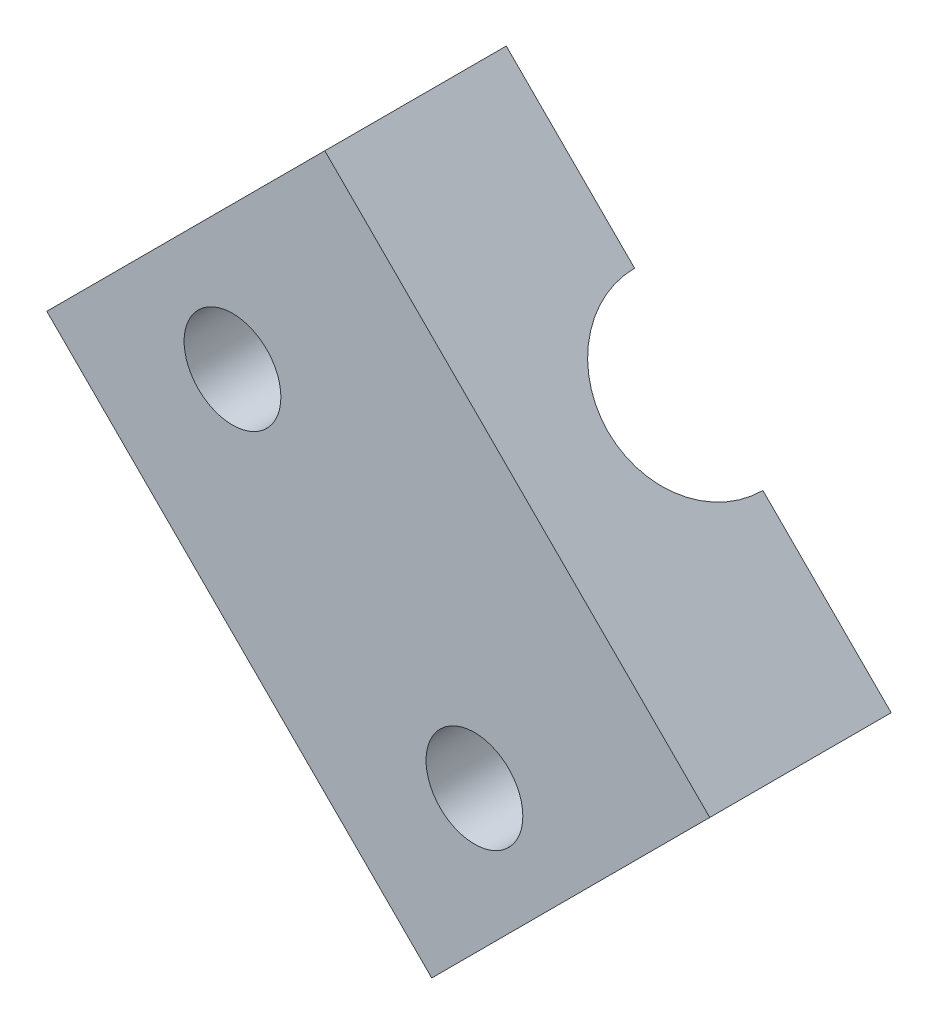
ISO-10303-21;
HEADER;
FILE_DESCRIPTION(('STEP AP214'),'2;1');
FILE_NAME('part.step','',(''),(''),'','','');
FILE_SCHEMA(('AUTOMOTIVE_DESIGN { 1 0 10303 214 1 1 1 1 }'));
ENDSEC;
DATA;
#1=APPLICATION_CONTEXT('core data for automotive mechanical design processes');
#2=APPLICATION_PROTOCOL_DEFINITION('international standard','automotive_design',2000,#1);
#3=PRODUCT_CONTEXT('',#1,'mechanical');
#4=PRODUCT('Part','Part','',(#3));
#5=PRODUCT_RELATED_PRODUCT_CATEGORY('part','',(#4));
#6=PRODUCT_DEFINITION_FORMATION('','',#4);
#7=PRODUCT_DEFINITION_CONTEXT('part definition',#1,'design');
#8=PRODUCT_DEFINITION('design','',#6,#7);
#9=PRODUCT_DEFINITION_SHAPE('','',#8);
#10=(LENGTH_UNIT() NAMED_UNIT(*) SI_UNIT(.MILLI.,.METRE.));
#11=(NAMED_UNIT(*) PLANE_ANGLE_UNIT() SI_UNIT($,.RADIAN.));
#12=(NAMED_UNIT(*) SI_UNIT($,.STERADIAN.) SOLID_ANGLE_UNIT());
#13=UNCERTAINTY_MEASURE_WITH_UNIT(LENGTH_MEASURE(1.E-05),#10,'distance_accuracy_value','');
#14=(GEOMETRIC_REPRESENTATION_CONTEXT(3) GLOBAL_UNCERTAINTY_ASSIGNED_CONTEXT((#13)) GLOBAL_UNIT_ASSIGNED_CONTEXT((#10,
#11,#12)) REPRESENTATION_CONTEXT('',''));
#15=CARTESIAN_POINT('',(0.,0.,0.));
#16=DIRECTION('',(0.,0.,1.));
#17=DIRECTION('',(1.,0.,0.));
#18=AXIS2_PLACEMENT_3D('',#15,#16,#17);
#19=CARTESIAN_POINT('',(9.19238815542513,9.1923881554251,0.));
#20=DIRECTION('',(-0.707106781186549,-0.707106781186546,0.));
#21=DIRECTION('',(0.707106781186546,-0.707106781186549,0.));
#22=AXIS2_PLACEMENT_3D('',#19,#20,#21);
#23=CYLINDRICAL_SURFACE('',#22,3.);
#24=DIRECTION('',(-0.707106781186549,-0.707106781186546,0.));
#25=VECTOR('',#24,1.);
#26=CARTESIAN_POINT('',(11.3137084989848,7.07106781186546,0.));
#27=LINE('',#26,#25);
#28=CARTESIAN_POINT('',(11.3137084989848,7.07106781186546,0.));
#29=VERTEX_POINT('',#28);
#30=CARTESIAN_POINT('',(4.24264068711929,0.,0.));
#31=VERTEX_POINT('',#30);
#32=EDGE_CURVE('E65',#29,#31,#27,.T.);
#33=ORIENTED_EDGE('',*,*,#32,.T.);
#34=CARTESIAN_POINT('',(2.12132034355965,2.12132034355964,0.));
#35=DIRECTION('',(-0.707106781186549,-0.707106781186546,0.));
#36=DIRECTION('',(0.707106781186546,-0.707106781186549,0.));
#37=AXIS2_PLACEMENT_3D('',#34,#35,#36);
#38=CIRCLE('',#37,3.);
#39=CARTESIAN_POINT('',(0.,4.24264068711929,0.));
#40=VERTEX_POINT('',#39);
#41=EDGE_CURVE('E197',#40,#31,#38,.F.);
#42=ORIENTED_EDGE('',*,*,#41,.F.);
#43=DIRECTION('',(-0.707106781186549,-0.707106781186546,0.));
#44=VECTOR('',#43,1.);
#45=CARTESIAN_POINT('',(7.0710678118655,11.3137084989848,0.));
#46=LINE('',#45,#44);
#47=CARTESIAN_POINT('',(7.0710678118655,11.3137084989848,0.));
#48=VERTEX_POINT('',#47);
#49=EDGE_CURVE('E11',#48,#40,#46,.T.);
#50=ORIENTED_EDGE('',*,*,#49,.F.);
#51=CARTESIAN_POINT('',(9.19238815542513,9.1923881554251,0.));
#52=DIRECTION('',(0.707106781186549,0.707106781186546,0.));
#53=DIRECTION('',(-0.707106781186546,0.707106781186549,0.));
#54=AXIS2_PLACEMENT_3D('',#51,#52,#53);
#55=CIRCLE('',#54,3.);
#56=EDGE_CURVE('E202',#48,#29,#55,.T.);
#57=ORIENTED_EDGE('',*,*,#56,.T.);
#58=EDGE_LOOP('',(#33,#42,#50,#57));
#59=FACE_BOUND('',#58,.T.);
#60=ADVANCED_FACE('F47',(#59),#23,.F.);
#61=CARTESIAN_POINT('',(9.19238815542513,9.1923881554251,0.));
#62=DIRECTION('',(0.,0.,-1.));
#63=DIRECTION('',(0.,1.,0.));
#64=AXIS2_PLACEMENT_3D('',#61,#62,#63);
#65=PLANE('',#64);
#66=CARTESIAN_POINT('',(-0.224049788463809,7.77595021153616,0.));
#67=DIRECTION('',(0.,0.,-1.));
#68=DIRECTION('',(0.,1.,0.));
#69=AXIS2_PLACEMENT_3D('',#66,#67,#68);
#70=CIRCLE('',#69,1.6);
#71=CARTESIAN_POINT('',(-0.224049788463809,9.37595021153616,0.));
#72=VERTEX_POINT('',#71);
#73=EDGE_CURVE('E188',#72,#72,#70,.T.);
#74=ORIENTED_EDGE('',*,*,#73,.F.);
#75=EDGE_LOOP('',(#74));
#76=FACE_BOUND('',#75,.T.);
#77=DIRECTION('',(0.707106781186546,-0.707106781186549,0.));
#78=VECTOR('',#77,1.);
#79=CARTESIAN_POINT('',(0.,0.,0.));
#80=LINE('',#79,#78);
#81=CARTESIAN_POINT('',(-6.3639610306789,6.36396103067893,0.));
#82=VERTEX_POINT('',#81);
#83=CARTESIAN_POINT('',(-0.707106781186544,0.707106781186551,0.));
#84=VERTEX_POINT('',#83);
#85=EDGE_CURVE('E136',#82,#84,#80,.T.);
#86=ORIENTED_EDGE('',*,*,#85,.F.);
#87=DIRECTION('',(-0.707106781186549,-0.707106781186546,0.));
#88=VECTOR('',#87,1.);
#89=CARTESIAN_POINT('',(2.82842712474623,15.556349186104,0.));
#90=LINE('',#89,#88);
#91=CARTESIAN_POINT('',(2.82842712474623,15.556349186104,0.));
#92=VERTEX_POINT('',#91);
#93=EDGE_CURVE('E57',#92,#82,#90,.T.);
#94=ORIENTED_EDGE('',*,*,#93,.F.);
#95=DIRECTION('',(0.707106781186546,-0.707106781186549,0.));
#96=VECTOR('',#95,1.);
#97=CARTESIAN_POINT('',(9.19238815542513,9.1923881554251,0.));
#98=LINE('',#97,#96);
#99=EDGE_CURVE('E133',#92,#48,#98,.T.);
#100=ORIENTED_EDGE('',*,*,#99,.T.);
#101=ORIENTED_EDGE('',*,*,#49,.T.);
#102=DIRECTION('',(-0.707106781186546,0.707106781186549,0.));
#103=VECTOR('',#102,1.);
#104=CARTESIAN_POINT('',(2.12132034355965,2.12132034355964,0.));
#105=LINE('',#104,#103);
#106=CARTESIAN_POINT('',(1.4142135623731,2.82842712474619,0.));
#107=VERTEX_POINT('',#106);
#108=EDGE_CURVE('E172',#107,#40,#105,.T.);
#109=ORIENTED_EDGE('',*,*,#108,.F.);
#110=DIRECTION('',(-0.707106781186549,-0.707106781186546,0.));
#111=VECTOR('',#110,1.);
#112=CARTESIAN_POINT('',(1.4142135623731,2.82842712474619,0.));
#113=LINE('',#112,#111);
#114=EDGE_CURVE('E141',#107,#84,#113,.T.);
#115=ORIENTED_EDGE('',*,*,#114,.T.);
#116=EDGE_LOOP('',(#86,#94,#100,#101,#109,#115));
#117=FACE_BOUND('',#116,.T.);
#118=ADVANCED_FACE('F167',(#76,#117),#65,.T.);
#119=CARTESIAN_POINT('',(2.82842712474623,15.556349186104,0.));
#120=DIRECTION('',(0.707106781186546,-0.707106781186549,0.));
#121=DIRECTION('',(0.707106781186549,0.707106781186546,0.));
#122=AXIS2_PLACEMENT_3D('',#119,#120,#121);
#123=PLANE('',#122);
#124=DIRECTION('',(0.,0.,1.));
#125=VECTOR('',#124,1.);
#126=CARTESIAN_POINT('',(-6.3639610306789,6.36396103067893,0.));
#127=LINE('',#126,#125);
#128=CARTESIAN_POINT('',(-6.3639610306789,6.36396103067893,6.00000000000001));
#129=VERTEX_POINT('',#128);
#130=EDGE_CURVE('E140',#82,#129,#127,.T.);
#131=ORIENTED_EDGE('',*,*,#130,.T.);
#132=DIRECTION('',(-0.707106781186549,-0.707106781186546,0.));
#133=VECTOR('',#132,1.);
#134=CARTESIAN_POINT('',(2.82842712474623,15.556349186104,6.00000000000001));
#135=LINE('',#134,#133);
#136=CARTESIAN_POINT('',(2.82842712474623,15.556349186104,6.00000000000001));
#137=VERTEX_POINT('',#136);
#138=EDGE_CURVE('E125',#137,#129,#135,.T.);
#139=ORIENTED_EDGE('',*,*,#138,.F.);
#140=DIRECTION('',(0.,0.,1.));
#141=VECTOR('',#140,1.);
#142=CARTESIAN_POINT('',(2.82842712474623,15.556349186104,0.));
#143=LINE('',#142,#141);
#144=EDGE_CURVE('E114',#92,#137,#143,.T.);
#145=ORIENTED_EDGE('',*,*,#144,.F.);
#146=ORIENTED_EDGE('',*,*,#93,.T.);
#147=EDGE_LOOP('',(#131,#139,#145,#146));
#148=FACE_BOUND('',#147,.T.);
#149=ADVANCED_FACE('F159',(#148),#123,.F.);
#150=CARTESIAN_POINT('',(9.19238815542513,9.1923881554251,6.00000000000001));
#151=DIRECTION('',(0.,0.,-1.));
#152=DIRECTION('',(0.,1.,0.));
#153=AXIS2_PLACEMENT_3D('',#150,#151,#152);
#154=PLANE('',#153);
#155=CARTESIAN_POINT('',(-0.224049788463809,7.77595021153616,6.00000000000001));
#156=DIRECTION('',(0.,0.,1.));
#157=DIRECTION('',(1.,0.,0.));
#158=AXIS2_PLACEMENT_3D('',#155,#156,#157);
#159=CIRCLE('',#158,1.6);
#160=CARTESIAN_POINT('',(1.37595021153619,7.77595021153616,6.00000000000001));
#161=VERTEX_POINT('',#160);
#162=EDGE_CURVE('E218',#161,#161,#159,.T.);
#163=ORIENTED_EDGE('',*,*,#162,.F.);
#164=EDGE_LOOP('',(#163));
#165=FACE_BOUND('',#164,.T.);
#166=CARTESIAN_POINT('',(7.77595021153618,-0.224049788463827,6.00000000000001));
#167=DIRECTION('',(0.,0.,1.));
#168=DIRECTION('',(1.,0.,0.));
#169=AXIS2_PLACEMENT_3D('',#166,#167,#168);
#170=CIRCLE('',#169,1.6);
#171=CARTESIAN_POINT('',(9.37595021153618,-0.224049788463827,6.00000000000001));
#172=VERTEX_POINT('',#171);
#173=EDGE_CURVE('E214',#172,#172,#170,.T.);
#174=ORIENTED_EDGE('',*,*,#173,.F.);
#175=EDGE_LOOP('',(#174));
#176=FACE_BOUND('',#175,.T.);
#177=DIRECTION('',(0.707106781186546,-0.707106781186549,0.));
#178=VECTOR('',#177,1.);
#179=CARTESIAN_POINT('',(0.,0.,6.00000000000001));
#180=LINE('',#179,#178);
#181=CARTESIAN_POINT('',(6.36396103067893,-6.36396103067896,6.));
#182=VERTEX_POINT('',#181);
#183=EDGE_CURVE('E122',#129,#182,#180,.T.);
#184=ORIENTED_EDGE('',*,*,#183,.T.);
#185=DIRECTION('',(-0.707106781186549,-0.707106781186546,0.));
#186=VECTOR('',#185,1.);
#187=CARTESIAN_POINT('',(15.5563491861041,2.82842712474614,6.));
#188=LINE('',#187,#186);
#189=CARTESIAN_POINT('',(15.5563491861041,2.82842712474614,6.));
#190=VERTEX_POINT('',#189);
#191=EDGE_CURVE('E84',#190,#182,#188,.T.);
#192=ORIENTED_EDGE('',*,*,#191,.F.);
#193=DIRECTION('',(0.707106781186546,-0.707106781186549,0.));
#194=VECTOR('',#193,1.);
#195=CARTESIAN_POINT('',(9.19238815542513,9.1923881554251,6.00000000000001));
#196=LINE('',#195,#194);
#197=EDGE_CURVE('E108',#137,#190,#196,.T.);
#198=ORIENTED_EDGE('',*,*,#197,.F.);
#199=ORIENTED_EDGE('',*,*,#138,.T.);
#200=EDGE_LOOP('',(#184,#192,#198,#199));
#201=FACE_BOUND('',#200,.T.);
#202=ADVANCED_FACE('F120',(#165,#176,#201),#154,.F.);
#203=CARTESIAN_POINT('',(15.5563491861041,2.82842712474614,0.));
#204=DIRECTION('',(0.707106781186546,-0.707106781186549,0.));
#205=DIRECTION('',(0.707106781186549,0.707106781186546,0.));
#206=AXIS2_PLACEMENT_3D('',#203,#204,#205);
#207=PLANE('',#206);
#208=DIRECTION('',(0.,0.,1.));
#209=VECTOR('',#208,1.);
#210=CARTESIAN_POINT('',(6.36396103067894,-6.36396103067896,0.));
#211=LINE('',#210,#209);
#212=CARTESIAN_POINT('',(6.36396103067894,-6.36396103067896,0.));
#213=VERTEX_POINT('',#212);
#214=EDGE_CURVE('E147',#213,#182,#211,.T.);
#215=ORIENTED_EDGE('',*,*,#214,.F.);
#216=DIRECTION('',(-0.707106781186549,-0.707106781186546,0.));
#217=VECTOR('',#216,1.);
#218=CARTESIAN_POINT('',(15.5563491861041,2.82842712474614,0.));
#219=LINE('',#218,#217);
#220=CARTESIAN_POINT('',(15.5563491861041,2.82842712474614,0.));
#221=VERTEX_POINT('',#220);
#222=EDGE_CURVE('E89',#221,#213,#219,.T.);
#223=ORIENTED_EDGE('',*,*,#222,.F.);
#224=DIRECTION('',(0.,0.,1.));
#225=VECTOR('',#224,1.);
#226=CARTESIAN_POINT('',(15.5563491861041,2.82842712474614,0.));
#227=LINE('',#226,#225);
#228=EDGE_CURVE('E111',#221,#190,#227,.T.);
#229=ORIENTED_EDGE('',*,*,#228,.T.);
#230=ORIENTED_EDGE('',*,*,#191,.T.);
#231=EDGE_LOOP('',(#215,#223,#229,#230));
#232=FACE_BOUND('',#231,.T.);
#233=ADVANCED_FACE('F127',(#232),#207,.T.);
#234=CARTESIAN_POINT('',(7.77595021153618,-0.224049788463827,0.));
#235=DIRECTION('',(0.,0.,-1.));
#236=DIRECTION('',(0.,1.,0.));
#237=AXIS2_PLACEMENT_3D('',#234,#235,#236);
#238=CIRCLE('',#237,1.6);
#239=CARTESIAN_POINT('',(7.77595021153618,1.37595021153617,0.));
#240=VERTEX_POINT('',#239);
#241=EDGE_CURVE('E50',#240,#240,#238,.T.);
#242=ORIENTED_EDGE('',*,*,#241,.F.);
#243=EDGE_LOOP('',(#242));
#244=FACE_BOUND('',#243,.T.);
#245=CARTESIAN_POINT('',(0.707106781186548,-0.707106781186547,0.));
#246=VERTEX_POINT('',#245);
#247=EDGE_CURVE('E142',#246,#213,#80,.T.);
#248=ORIENTED_EDGE('',*,*,#247,.F.);
#249=DIRECTION('',(-0.707106781186549,-0.707106781186546,0.));
#250=VECTOR('',#249,1.);
#251=CARTESIAN_POINT('',(2.82842712474619,1.41421356237309,0.));
#252=LINE('',#251,#250);
#253=CARTESIAN_POINT('',(2.82842712474619,1.41421356237309,0.));
#254=VERTEX_POINT('',#253);
#255=EDGE_CURVE('E179',#254,#246,#252,.T.);
#256=ORIENTED_EDGE('',*,*,#255,.F.);
#257=EDGE_CURVE('E192',#31,#254,#105,.T.);
#258=ORIENTED_EDGE('',*,*,#257,.F.);
#259=ORIENTED_EDGE('',*,*,#32,.F.);
#260=EDGE_CURVE('E129',#29,#221,#98,.T.);
#261=ORIENTED_EDGE('',*,*,#260,.T.);
#262=ORIENTED_EDGE('',*,*,#222,.T.);
#263=EDGE_LOOP('',(#248,#256,#258,#259,#261,#262));
#264=FACE_BOUND('',#263,.T.);
#265=ADVANCED_FACE('F230',(#244,#264),#65,.T.);
#266=CARTESIAN_POINT('',(9.19238815542513,9.1923881554251,0.));
#267=DIRECTION('',(0.707106781186549,0.707106781186546,0.));
#268=DIRECTION('',(-0.707106781186546,0.707106781186549,0.));
#269=AXIS2_PLACEMENT_3D('',#266,#267,#268);
#270=PLANE('',#269);
#271=ORIENTED_EDGE('',*,*,#56,.F.);
#272=ORIENTED_EDGE('',*,*,#99,.F.);
#273=ORIENTED_EDGE('',*,*,#144,.T.);
#274=ORIENTED_EDGE('',*,*,#197,.T.);
#275=ORIENTED_EDGE('',*,*,#228,.F.);
#276=ORIENTED_EDGE('',*,*,#260,.F.);
#277=EDGE_LOOP('',(#271,#272,#273,#274,#275,#276));
#278=FACE_BOUND('',#277,.T.);
#279=ADVANCED_FACE('F109',(#278),#270,.T.);
#280=CARTESIAN_POINT('',(0.,0.,0.));
#281=DIRECTION('',(0.707106781186549,0.707106781186546,0.));
#282=DIRECTION('',(-0.707106781186546,0.707106781186549,0.));
#283=AXIS2_PLACEMENT_3D('',#280,#281,#282);
#284=PLANE('',#283);
#285=ORIENTED_EDGE('',*,*,#85,.T.);
#286=CARTESIAN_POINT('',(0.,0.,0.));
#287=DIRECTION('',(-0.707106781186549,-0.707106781186546,0.));
#288=DIRECTION('',(0.707106781186546,-0.707106781186549,0.));
#289=AXIS2_PLACEMENT_3D('',#286,#287,#288);
#290=CIRCLE('',#289,1.);
#291=EDGE_CURVE('E182',#246,#84,#290,.T.);
#292=ORIENTED_EDGE('',*,*,#291,.F.);
#293=ORIENTED_EDGE('',*,*,#247,.T.);
#294=ORIENTED_EDGE('',*,*,#214,.T.);
#295=ORIENTED_EDGE('',*,*,#183,.F.);
#296=ORIENTED_EDGE('',*,*,#130,.F.);
#297=EDGE_LOOP('',(#285,#292,#293,#294,#295,#296));
#298=FACE_BOUND('',#297,.T.);
#299=ADVANCED_FACE('F164',(#298),#284,.F.);
#300=CARTESIAN_POINT('',(2.12132034355965,2.12132034355964,0.));
#301=DIRECTION('',(-0.707106781186549,-0.707106781186546,0.));
#302=DIRECTION('',(0.707106781186546,-0.707106781186549,0.));
#303=AXIS2_PLACEMENT_3D('',#300,#301,#302);
#304=CYLINDRICAL_SURFACE('',#303,1.);
#305=ORIENTED_EDGE('',*,*,#291,.T.);
#306=ORIENTED_EDGE('',*,*,#114,.F.);
#307=CARTESIAN_POINT('',(2.12132034355965,2.12132034355964,0.));
#308=DIRECTION('',(-0.707106781186549,-0.707106781186546,0.));
#309=DIRECTION('',(0.707106781186546,-0.707106781186549,0.));
#310=AXIS2_PLACEMENT_3D('',#307,#308,#309);
#311=CIRCLE('',#310,1.);
#312=EDGE_CURVE('E187',#254,#107,#311,.T.);
#313=ORIENTED_EDGE('',*,*,#312,.F.);
#314=ORIENTED_EDGE('',*,*,#255,.T.);
#315=EDGE_LOOP('',(#305,#306,#313,#314));
#316=FACE_BOUND('',#315,.T.);
#317=ADVANCED_FACE('F183',(#316),#304,.F.);
#318=CARTESIAN_POINT('',(2.12132034355965,2.12132034355964,0.));
#319=DIRECTION('',(-0.707106781186549,-0.707106781186546,0.));
#320=DIRECTION('',(0.707106781186546,-0.707106781186549,0.));
#321=AXIS2_PLACEMENT_3D('',#318,#319,#320);
#322=PLANE('',#321);
#323=ORIENTED_EDGE('',*,*,#312,.T.);
#324=ORIENTED_EDGE('',*,*,#108,.T.);
#325=ORIENTED_EDGE('',*,*,#41,.T.);
#326=ORIENTED_EDGE('',*,*,#257,.T.);
#327=EDGE_LOOP('',(#323,#324,#325,#326));
#328=FACE_BOUND('',#327,.T.);
#329=ADVANCED_FACE('F239',(#328),#322,.F.);
#330=CARTESIAN_POINT('',(7.77595021153618,-0.224049788463827,-3.99999999999999));
#331=DIRECTION('',(0.,0.,1.));
#332=DIRECTION('',(1.,0.,0.));
#333=AXIS2_PLACEMENT_3D('',#330,#331,#332);
#334=CYLINDRICAL_SURFACE('',#333,1.6);
#335=ORIENTED_EDGE('',*,*,#241,.T.);
#336=EDGE_LOOP('',(#335));
#337=FACE_BOUND('',#336,.T.);
#338=ORIENTED_EDGE('',*,*,#173,.T.);
#339=EDGE_LOOP('',(#338));
#340=FACE_BOUND('',#339,.T.);
#341=ADVANCED_FACE('F227',(#337,#340),#334,.F.);
#342=CARTESIAN_POINT('',(-0.224049788463809,7.77595021153616,-3.99999999999999));
#343=DIRECTION('',(0.,0.,1.));
#344=DIRECTION('',(1.,0.,0.));
#345=AXIS2_PLACEMENT_3D('',#342,#343,#344);
#346=CYLINDRICAL_SURFACE('',#345,1.6);
#347=ORIENTED_EDGE('',*,*,#73,.T.);
#348=EDGE_LOOP('',(#347));
#349=FACE_BOUND('',#348,.T.);
#350=ORIENTED_EDGE('',*,*,#162,.T.);
#351=EDGE_LOOP('',(#350));
#352=FACE_BOUND('',#351,.T.);
#353=ADVANCED_FACE('F264',(#349,#352),#346,.F.);
#354=CLOSED_SHELL('',(#60,#118,#149,#202,#233,#265,#279,#299,#317,#329,#341,#353));
#355=MANIFOLD_SOLID_BREP('B2',#354);
#356=ADVANCED_BREP_SHAPE_REPRESENTATION('',(#18,#355),#14);
#357=SHAPE_DEFINITION_REPRESENTATION(#9,#356);
ENDSEC;
END-ISO-10303-21;
